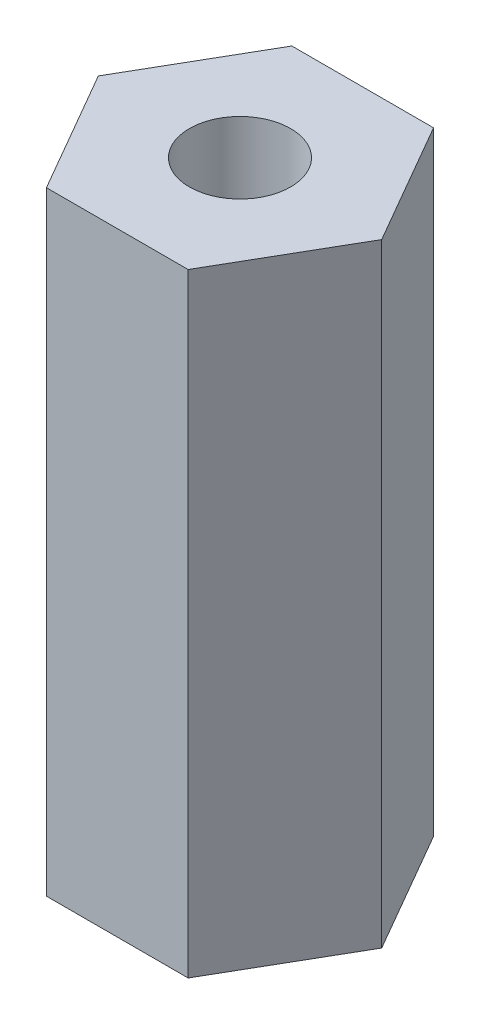
ISO-10303-21;
HEADER;
FILE_DESCRIPTION(('STEP AP214'),'2;1');
FILE_NAME('part.step','',(''),(''),'','','');
FILE_SCHEMA(('AUTOMOTIVE_DESIGN { 1 0 10303 214 1 1 1 1 }'));
ENDSEC;
DATA;
#1=APPLICATION_CONTEXT('core data for automotive mechanical design processes');
#2=APPLICATION_PROTOCOL_DEFINITION('international standard','automotive_design',2000,#1);
#3=PRODUCT_CONTEXT('',#1,'mechanical');
#4=PRODUCT('Part','Part','',(#3));
#5=PRODUCT_RELATED_PRODUCT_CATEGORY('part','',(#4));
#6=PRODUCT_DEFINITION_FORMATION('','',#4);
#7=PRODUCT_DEFINITION_CONTEXT('part definition',#1,'design');
#8=PRODUCT_DEFINITION('design','',#6,#7);
#9=PRODUCT_DEFINITION_SHAPE('','',#8);
#10=(LENGTH_UNIT() NAMED_UNIT(*) SI_UNIT(.MILLI.,.METRE.));
#11=(NAMED_UNIT(*) PLANE_ANGLE_UNIT() SI_UNIT($,.RADIAN.));
#12=(NAMED_UNIT(*) SI_UNIT($,.STERADIAN.) SOLID_ANGLE_UNIT());
#13=UNCERTAINTY_MEASURE_WITH_UNIT(LENGTH_MEASURE(1.E-05),#10,'distance_accuracy_value','');
#14=(GEOMETRIC_REPRESENTATION_CONTEXT(3) GLOBAL_UNCERTAINTY_ASSIGNED_CONTEXT((#13)) GLOBAL_UNIT_ASSIGNED_CONTEXT((#10,
#11,#12)) REPRESENTATION_CONTEXT('',''));
#15=CARTESIAN_POINT('',(0.,0.,0.));
#16=DIRECTION('',(0.,0.,1.));
#17=DIRECTION('',(1.,0.,0.));
#18=AXIS2_PLACEMENT_3D('',#15,#16,#17);
#19=CARTESIAN_POINT('',(2.3094010767585,20.,-4.));
#20=DIRECTION('',(-0.866025403784439,0.,0.5));
#21=DIRECTION('',(0.5,0.,0.866025403784439));
#22=AXIS2_PLACEMENT_3D('',#19,#20,#21);
#23=PLANE('',#22);
#24=DIRECTION('',(-0.5,0.,-0.866025403784439));
#25=VECTOR('',#24,1.);
#26=CARTESIAN_POINT('',(2.3094010767585,0.,-4.));
#27=LINE('',#26,#25);
#28=CARTESIAN_POINT('',(4.61880215351701,0.,0.));
#29=VERTEX_POINT('',#28);
#30=CARTESIAN_POINT('',(2.3094010767585,0.,-4.));
#31=VERTEX_POINT('',#30);
#32=EDGE_CURVE('E142',#29,#31,#27,.T.);
#33=ORIENTED_EDGE('',*,*,#32,.T.);
#34=DIRECTION('',(0.,-1.,0.));
#35=VECTOR('',#34,1.);
#36=CARTESIAN_POINT('',(2.3094010767585,20.,-4.));
#37=LINE('',#36,#35);
#38=CARTESIAN_POINT('',(2.3094010767585,20.,-4.));
#39=VERTEX_POINT('',#38);
#40=EDGE_CURVE('E11',#39,#31,#37,.T.);
#41=ORIENTED_EDGE('',*,*,#40,.F.);
#42=DIRECTION('',(-0.5,0.,-0.866025403784439));
#43=VECTOR('',#42,1.);
#44=CARTESIAN_POINT('',(2.3094010767585,20.,-4.));
#45=LINE('',#44,#43);
#46=CARTESIAN_POINT('',(4.61880215351701,20.,0.));
#47=VERTEX_POINT('',#46);
#48=EDGE_CURVE('E158',#47,#39,#45,.T.);
#49=ORIENTED_EDGE('',*,*,#48,.F.);
#50=DIRECTION('',(0.,-1.,0.));
#51=VECTOR('',#50,1.);
#52=CARTESIAN_POINT('',(4.61880215351701,20.,0.));
#53=LINE('',#52,#51);
#54=EDGE_CURVE('E138',#47,#29,#53,.T.);
#55=ORIENTED_EDGE('',*,*,#54,.T.);
#56=EDGE_LOOP('',(#33,#41,#49,#55));
#57=FACE_BOUND('',#56,.T.);
#58=ADVANCED_FACE('F51',(#57),#23,.F.);
#59=CARTESIAN_POINT('',(-2.30940107675851,20.,-4.));
#60=DIRECTION('',(0.,0.,1.));
#61=DIRECTION('',(1.,0.,0.));
#62=AXIS2_PLACEMENT_3D('',#59,#60,#61);
#63=PLANE('',#62);
#64=DIRECTION('',(-1.,0.,0.));
#65=VECTOR('',#64,1.);
#66=CARTESIAN_POINT('',(-2.30940107675851,0.,-4.));
#67=LINE('',#66,#65);
#68=CARTESIAN_POINT('',(-2.30940107675851,0.,-4.));
#69=VERTEX_POINT('',#68);
#70=EDGE_CURVE('E146',#31,#69,#67,.T.);
#71=ORIENTED_EDGE('',*,*,#70,.T.);
#72=DIRECTION('',(0.,-1.,0.));
#73=VECTOR('',#72,1.);
#74=CARTESIAN_POINT('',(-2.30940107675851,20.,-4.));
#75=LINE('',#74,#73);
#76=CARTESIAN_POINT('',(-2.30940107675851,20.,-4.));
#77=VERTEX_POINT('',#76);
#78=EDGE_CURVE('E61',#77,#69,#75,.T.);
#79=ORIENTED_EDGE('',*,*,#78,.F.);
#80=DIRECTION('',(-1.,0.,0.));
#81=VECTOR('',#80,1.);
#82=CARTESIAN_POINT('',(-2.30940107675851,20.,-4.));
#83=LINE('',#82,#81);
#84=EDGE_CURVE('E106',#39,#77,#83,.T.);
#85=ORIENTED_EDGE('',*,*,#84,.F.);
#86=ORIENTED_EDGE('',*,*,#40,.T.);
#87=EDGE_LOOP('',(#71,#79,#85,#86));
#88=FACE_BOUND('',#87,.T.);
#89=ADVANCED_FACE('F188',(#88),#63,.F.);
#90=CARTESIAN_POINT('',(-4.61880215351701,20.,0.));
#91=DIRECTION('',(0.866025403784439,0.,0.5));
#92=DIRECTION('',(0.5,0.,-0.866025403784439));
#93=AXIS2_PLACEMENT_3D('',#90,#91,#92);
#94=PLANE('',#93);
#95=DIRECTION('',(-0.499999999999999,0.,0.866025403784439));
#96=VECTOR('',#95,1.);
#97=CARTESIAN_POINT('',(-4.61880215351701,0.,0.));
#98=LINE('',#97,#96);
#99=CARTESIAN_POINT('',(-4.61880215351701,0.,0.));
#100=VERTEX_POINT('',#99);
#101=EDGE_CURVE('E150',#69,#100,#98,.T.);
#102=ORIENTED_EDGE('',*,*,#101,.T.);
#103=DIRECTION('',(0.,-1.,0.));
#104=VECTOR('',#103,1.);
#105=CARTESIAN_POINT('',(-4.61880215351701,20.,0.));
#106=LINE('',#105,#104);
#107=CARTESIAN_POINT('',(-4.61880215351701,20.,0.));
#108=VERTEX_POINT('',#107);
#109=EDGE_CURVE('E130',#108,#100,#106,.T.);
#110=ORIENTED_EDGE('',*,*,#109,.F.);
#111=DIRECTION('',(-0.499999999999999,0.,0.866025403784439));
#112=VECTOR('',#111,1.);
#113=CARTESIAN_POINT('',(-4.61880215351701,20.,0.));
#114=LINE('',#113,#112);
#115=EDGE_CURVE('E119',#77,#108,#114,.T.);
#116=ORIENTED_EDGE('',*,*,#115,.F.);
#117=ORIENTED_EDGE('',*,*,#78,.T.);
#118=EDGE_LOOP('',(#102,#110,#116,#117));
#119=FACE_BOUND('',#118,.T.);
#120=ADVANCED_FACE('F169',(#119),#94,.F.);
#121=CARTESIAN_POINT('',(-2.3094010767585,20.,4.));
#122=DIRECTION('',(0.866025403784439,0.,-0.5));
#123=DIRECTION('',(-0.5,0.,-0.866025403784439));
#124=AXIS2_PLACEMENT_3D('',#121,#122,#123);
#125=PLANE('',#124);
#126=DIRECTION('',(0.5,0.,0.866025403784438));
#127=VECTOR('',#126,1.);
#128=CARTESIAN_POINT('',(-2.3094010767585,0.,4.));
#129=LINE('',#128,#127);
#130=CARTESIAN_POINT('',(-2.3094010767585,0.,4.));
#131=VERTEX_POINT('',#130);
#132=EDGE_CURVE('E128',#100,#131,#129,.T.);
#133=ORIENTED_EDGE('',*,*,#132,.T.);
#134=DIRECTION('',(0.,-1.,0.));
#135=VECTOR('',#134,1.);
#136=CARTESIAN_POINT('',(-2.3094010767585,20.,4.));
#137=LINE('',#136,#135);
#138=CARTESIAN_POINT('',(-2.3094010767585,20.,4.));
#139=VERTEX_POINT('',#138);
#140=EDGE_CURVE('E125',#139,#131,#137,.T.);
#141=ORIENTED_EDGE('',*,*,#140,.F.);
#142=DIRECTION('',(0.5,0.,0.866025403784438));
#143=VECTOR('',#142,1.);
#144=CARTESIAN_POINT('',(-2.3094010767585,20.,4.));
#145=LINE('',#144,#143);
#146=EDGE_CURVE('E113',#108,#139,#145,.T.);
#147=ORIENTED_EDGE('',*,*,#146,.F.);
#148=ORIENTED_EDGE('',*,*,#109,.T.);
#149=EDGE_LOOP('',(#133,#141,#147,#148));
#150=FACE_BOUND('',#149,.T.);
#151=ADVANCED_FACE('F126',(#150),#125,.F.);
#152=CARTESIAN_POINT('',(2.3094010767585,20.,4.));
#153=DIRECTION('',(0.,0.,-1.));
#154=DIRECTION('',(-1.,0.,0.));
#155=AXIS2_PLACEMENT_3D('',#152,#153,#154);
#156=PLANE('',#155);
#157=DIRECTION('',(1.,0.,0.));
#158=VECTOR('',#157,1.);
#159=CARTESIAN_POINT('',(2.3094010767585,0.,4.));
#160=LINE('',#159,#158);
#161=CARTESIAN_POINT('',(2.3094010767585,0.,4.));
#162=VERTEX_POINT('',#161);
#163=EDGE_CURVE('E92',#131,#162,#160,.T.);
#164=ORIENTED_EDGE('',*,*,#163,.T.);
#165=DIRECTION('',(0.,-1.,0.));
#166=VECTOR('',#165,1.);
#167=CARTESIAN_POINT('',(2.3094010767585,20.,4.));
#168=LINE('',#167,#166);
#169=CARTESIAN_POINT('',(2.3094010767585,20.,4.));
#170=VERTEX_POINT('',#169);
#171=EDGE_CURVE('E131',#170,#162,#168,.T.);
#172=ORIENTED_EDGE('',*,*,#171,.F.);
#173=DIRECTION('',(1.,0.,0.));
#174=VECTOR('',#173,1.);
#175=CARTESIAN_POINT('',(2.3094010767585,20.,4.));
#176=LINE('',#175,#174);
#177=EDGE_CURVE('E117',#139,#170,#176,.T.);
#178=ORIENTED_EDGE('',*,*,#177,.F.);
#179=ORIENTED_EDGE('',*,*,#140,.T.);
#180=EDGE_LOOP('',(#164,#172,#178,#179));
#181=FACE_BOUND('',#180,.T.);
#182=ADVANCED_FACE('F133',(#181),#156,.F.);
#183=CARTESIAN_POINT('',(4.61880215351701,20.,0.));
#184=DIRECTION('',(-0.866025403784439,0.,-0.5));
#185=DIRECTION('',(-0.5,0.,0.866025403784439));
#186=AXIS2_PLACEMENT_3D('',#183,#184,#185);
#187=PLANE('',#186);
#188=DIRECTION('',(0.5,0.,-0.866025403784439));
#189=VECTOR('',#188,1.);
#190=CARTESIAN_POINT('',(4.61880215351701,0.,0.));
#191=LINE('',#190,#189);
#192=EDGE_CURVE('E98',#162,#29,#191,.T.);
#193=ORIENTED_EDGE('',*,*,#192,.T.);
#194=ORIENTED_EDGE('',*,*,#54,.F.);
#195=DIRECTION('',(0.5,0.,-0.866025403784439));
#196=VECTOR('',#195,1.);
#197=CARTESIAN_POINT('',(4.61880215351701,20.,0.));
#198=LINE('',#197,#196);
#199=EDGE_CURVE('E69',#170,#47,#198,.T.);
#200=ORIENTED_EDGE('',*,*,#199,.F.);
#201=ORIENTED_EDGE('',*,*,#171,.T.);
#202=EDGE_LOOP('',(#193,#194,#200,#201));
#203=FACE_BOUND('',#202,.T.);
#204=ADVANCED_FACE('F176',(#203),#187,.F.);
#205=CARTESIAN_POINT('',(0.,20.,0.));
#206=DIRECTION('',(0.,-1.,0.));
#207=DIRECTION('',(0.,0.,-1.));
#208=AXIS2_PLACEMENT_3D('',#205,#206,#207);
#209=PLANE('',#208);
#210=CARTESIAN_POINT('',(0.,20.,0.));
#211=DIRECTION('',(0.,1.,0.));
#212=DIRECTION('',(0.,0.,1.));
#213=AXIS2_PLACEMENT_3D('',#210,#211,#212);
#214=CIRCLE('',#213,1.65);
#215=CARTESIAN_POINT('',(0.,20.,1.65));
#216=VERTEX_POINT('',#215);
#217=EDGE_CURVE('E224',#216,#216,#214,.T.);
#218=ORIENTED_EDGE('',*,*,#217,.F.);
#219=EDGE_LOOP('',(#218));
#220=FACE_BOUND('',#219,.T.);
#221=ORIENTED_EDGE('',*,*,#48,.T.);
#222=ORIENTED_EDGE('',*,*,#84,.T.);
#223=ORIENTED_EDGE('',*,*,#115,.T.);
#224=ORIENTED_EDGE('',*,*,#146,.T.);
#225=ORIENTED_EDGE('',*,*,#177,.T.);
#226=ORIENTED_EDGE('',*,*,#199,.T.);
#227=EDGE_LOOP('',(#221,#222,#223,#224,#225,#226));
#228=FACE_BOUND('',#227,.T.);
#229=ADVANCED_FACE('F115',(#220,#228),#209,.F.);
#230=CARTESIAN_POINT('',(0.,0.,0.));
#231=DIRECTION('',(0.,-1.,0.));
#232=DIRECTION('',(0.,0.,-1.));
#233=AXIS2_PLACEMENT_3D('',#230,#231,#232);
#234=PLANE('',#233);
#235=CARTESIAN_POINT('',(0.,0.,0.));
#236=DIRECTION('',(0.,1.,0.));
#237=DIRECTION('',(0.,0.,1.));
#238=AXIS2_PLACEMENT_3D('',#235,#236,#237);
#239=CIRCLE('',#238,1.65);
#240=CARTESIAN_POINT('',(0.,0.,1.65));
#241=VERTEX_POINT('',#240);
#242=EDGE_CURVE('E223',#241,#241,#239,.T.);
#243=ORIENTED_EDGE('',*,*,#242,.T.);
#244=EDGE_LOOP('',(#243));
#245=FACE_BOUND('',#244,.T.);
#246=ORIENTED_EDGE('',*,*,#32,.F.);
#247=ORIENTED_EDGE('',*,*,#192,.F.);
#248=ORIENTED_EDGE('',*,*,#163,.F.);
#249=ORIENTED_EDGE('',*,*,#132,.F.);
#250=ORIENTED_EDGE('',*,*,#101,.F.);
#251=ORIENTED_EDGE('',*,*,#70,.F.);
#252=EDGE_LOOP('',(#246,#247,#248,#249,#250,#251));
#253=FACE_BOUND('',#252,.T.);
#254=ADVANCED_FACE('F172',(#245,#253),#234,.T.);
#255=CARTESIAN_POINT('',(0.,6.,0.));
#256=DIRECTION('',(0.,-1.,0.));
#257=DIRECTION('',(0.,0.,-1.));
#258=AXIS2_PLACEMENT_3D('',#255,#256,#257);
#259=CYLINDRICAL_SURFACE('',#258,1.65);
#260=CARTESIAN_POINT('',(0.,6.,0.));
#261=DIRECTION('',(0.,1.,0.));
#262=DIRECTION('',(0.,0.,1.));
#263=AXIS2_PLACEMENT_3D('',#260,#261,#262);
#264=CIRCLE('',#263,1.65);
#265=CARTESIAN_POINT('',(0.,6.,1.65));
#266=VERTEX_POINT('',#265);
#267=EDGE_CURVE('E147',#266,#266,#264,.T.);
#268=ORIENTED_EDGE('',*,*,#267,.T.);
#269=EDGE_LOOP('',(#268));
#270=FACE_BOUND('',#269,.T.);
#271=ORIENTED_EDGE('',*,*,#242,.F.);
#272=EDGE_LOOP('',(#271));
#273=FACE_BOUND('',#272,.T.);
#274=ADVANCED_FACE('F205',(#270,#273),#259,.F.);
#275=CARTESIAN_POINT('',(0.,6.,0.));
#276=DIRECTION('',(0.,1.,0.));
#277=DIRECTION('',(0.,0.,1.));
#278=AXIS2_PLACEMENT_3D('',#275,#276,#277);
#279=PLANE('',#278);
#280=ORIENTED_EDGE('',*,*,#267,.F.);
#281=EDGE_LOOP('',(#280));
#282=FACE_BOUND('',#281,.T.);
#283=ADVANCED_FACE('F208',(#282),#279,.F.);
#284=CARTESIAN_POINT('',(0.,14.,0.));
#285=DIRECTION('',(0.,1.,0.));
#286=DIRECTION('',(0.,0.,1.));
#287=AXIS2_PLACEMENT_3D('',#284,#285,#286);
#288=CYLINDRICAL_SURFACE('',#287,1.65);
#289=CARTESIAN_POINT('',(0.,14.,0.));
#290=DIRECTION('',(0.,1.,0.));
#291=DIRECTION('',(0.,0.,1.));
#292=AXIS2_PLACEMENT_3D('',#289,#290,#291);
#293=CIRCLE('',#292,1.65);
#294=CARTESIAN_POINT('',(0.,14.,1.65));
#295=VERTEX_POINT('',#294);
#296=EDGE_CURVE('E221',#295,#295,#293,.T.);
#297=ORIENTED_EDGE('',*,*,#296,.F.);
#298=EDGE_LOOP('',(#297));
#299=FACE_BOUND('',#298,.T.);
#300=ORIENTED_EDGE('',*,*,#217,.T.);
#301=EDGE_LOOP('',(#300));
#302=FACE_BOUND('',#301,.T.);
#303=ADVANCED_FACE('F210',(#299,#302),#288,.F.);
#304=CARTESIAN_POINT('',(0.,14.,0.));
#305=DIRECTION('',(0.,1.,0.));
#306=DIRECTION('',(0.,0.,1.));
#307=AXIS2_PLACEMENT_3D('',#304,#305,#306);
#308=PLANE('',#307);
#309=ORIENTED_EDGE('',*,*,#296,.T.);
#310=EDGE_LOOP('',(#309));
#311=FACE_BOUND('',#310,.T.);
#312=ADVANCED_FACE('F213',(#311),#308,.T.);
#313=CLOSED_SHELL('',(#58,#89,#120,#151,#182,#204,#229,#254,#274,#283,#303,#312));
#314=MANIFOLD_SOLID_BREP('B2',#313);
#315=ADVANCED_BREP_SHAPE_REPRESENTATION('',(#18,#314),#14);
#316=SHAPE_DEFINITION_REPRESENTATION(#9,#315);
ENDSEC;
END-ISO-10303-21;
